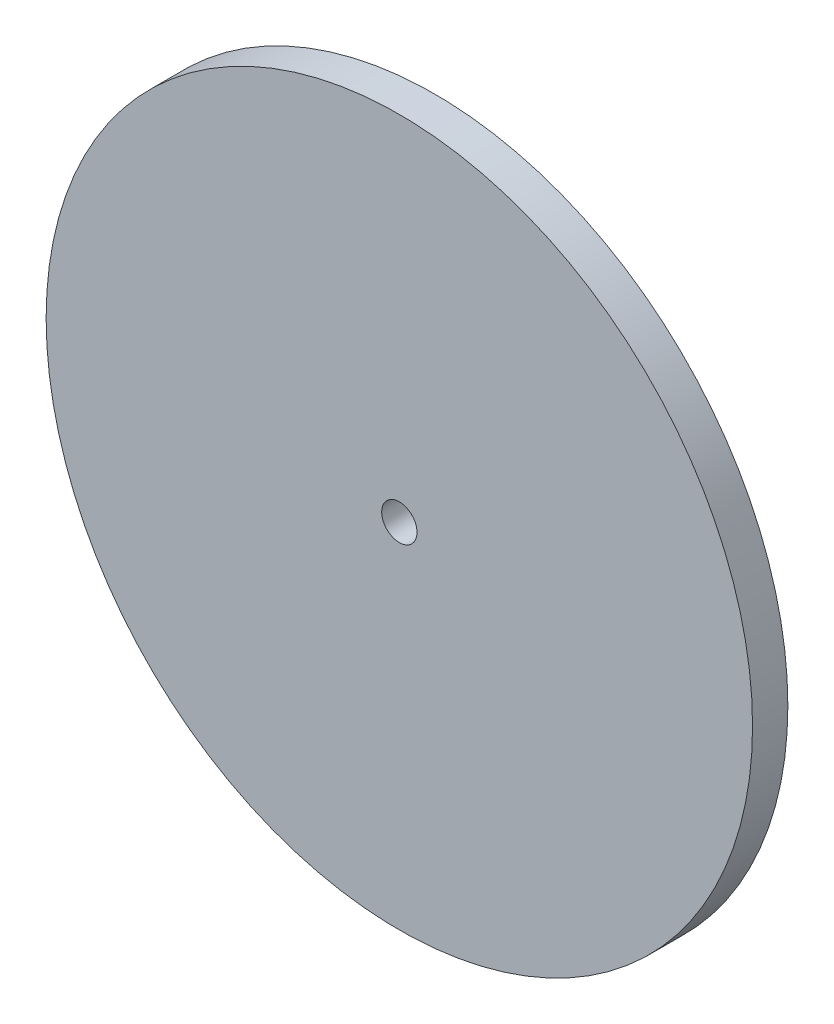
ISO-10303-21;
HEADER;
FILE_DESCRIPTION(('STEP AP214'),'2;1');
FILE_NAME('part.step','',(''),(''),'','','');
FILE_SCHEMA(('AUTOMOTIVE_DESIGN { 1 0 10303 214 1 1 1 1 }'));
ENDSEC;
DATA;
#1=APPLICATION_CONTEXT('core data for automotive mechanical design processes');
#2=APPLICATION_PROTOCOL_DEFINITION('international standard','automotive_design',2000,#1);
#3=PRODUCT_CONTEXT('',#1,'mechanical');
#4=PRODUCT('Part','Part','',(#3));
#5=PRODUCT_RELATED_PRODUCT_CATEGORY('part','',(#4));
#6=PRODUCT_DEFINITION_FORMATION('','',#4);
#7=PRODUCT_DEFINITION_CONTEXT('part definition',#1,'design');
#8=PRODUCT_DEFINITION('design','',#6,#7);
#9=PRODUCT_DEFINITION_SHAPE('','',#8);
#10=(LENGTH_UNIT() NAMED_UNIT(*) SI_UNIT(.MILLI.,.METRE.));
#11=(NAMED_UNIT(*) PLANE_ANGLE_UNIT() SI_UNIT($,.RADIAN.));
#12=(NAMED_UNIT(*) SI_UNIT($,.STERADIAN.) SOLID_ANGLE_UNIT());
#13=UNCERTAINTY_MEASURE_WITH_UNIT(LENGTH_MEASURE(1.E-05),#10,'distance_accuracy_value','');
#14=(GEOMETRIC_REPRESENTATION_CONTEXT(3) GLOBAL_UNCERTAINTY_ASSIGNED_CONTEXT((#13)) GLOBAL_UNIT_ASSIGNED_CONTEXT((#10,
#11,#12)) REPRESENTATION_CONTEXT('',''));
#15=CARTESIAN_POINT('',(0.,0.,0.));
#16=DIRECTION('',(0.,0.,1.));
#17=DIRECTION('',(1.,0.,0.));
#18=AXIS2_PLACEMENT_3D('',#15,#16,#17);
#19=CARTESIAN_POINT('',(0.,0.,25.));
#20=DIRECTION('',(0.,0.,-1.));
#21=DIRECTION('',(-1.,0.,0.));
#22=AXIS2_PLACEMENT_3D('',#19,#20,#21);
#23=CYLINDRICAL_SURFACE('',#22,500.);
#24=CARTESIAN_POINT('',(0.,0.,25.));
#25=DIRECTION('',(0.,0.,1.));
#26=DIRECTION('',(1.,0.,0.));
#27=AXIS2_PLACEMENT_3D('',#24,#25,#26);
#28=CIRCLE('',#27,500.);
#29=CARTESIAN_POINT('',(500.,0.,25.));
#30=VERTEX_POINT('',#29);
#31=EDGE_CURVE('E10',#30,#30,#28,.T.);
#32=ORIENTED_EDGE('',*,*,#31,.F.);
#33=EDGE_LOOP('',(#32));
#34=FACE_BOUND('',#33,.T.);
#35=CARTESIAN_POINT('',(0.,0.,-25.));
#36=DIRECTION('',(0.,0.,1.));
#37=DIRECTION('',(1.,0.,0.));
#38=AXIS2_PLACEMENT_3D('',#35,#36,#37);
#39=CIRCLE('',#38,500.);
#40=CARTESIAN_POINT('',(500.,0.,-25.));
#41=VERTEX_POINT('',#40);
#42=EDGE_CURVE('E37',#41,#41,#39,.T.);
#43=ORIENTED_EDGE('',*,*,#42,.T.);
#44=EDGE_LOOP('',(#43));
#45=FACE_BOUND('',#44,.T.);
#46=ADVANCED_FACE('F34',(#34,#45),#23,.T.);
#47=CARTESIAN_POINT('',(0.,0.,25.));
#48=DIRECTION('',(0.,0.,1.));
#49=DIRECTION('',(1.,0.,0.));
#50=AXIS2_PLACEMENT_3D('',#47,#48,#49);
#51=PLANE('',#50);
#52=CARTESIAN_POINT('',(0.,0.,25.));
#53=DIRECTION('',(0.,0.,1.));
#54=DIRECTION('',(1.,0.,0.));
#55=AXIS2_PLACEMENT_3D('',#52,#53,#54);
#56=CIRCLE('',#55,25.);
#57=CARTESIAN_POINT('',(25.,0.,25.));
#58=VERTEX_POINT('',#57);
#59=EDGE_CURVE('E48',#58,#58,#56,.T.);
#60=ORIENTED_EDGE('',*,*,#59,.F.);
#61=EDGE_LOOP('',(#60));
#62=FACE_BOUND('',#61,.T.);
#63=ORIENTED_EDGE('',*,*,#31,.T.);
#64=EDGE_LOOP('',(#63));
#65=FACE_BOUND('',#64,.T.);
#66=ADVANCED_FACE('F55',(#62,#65),#51,.T.);
#67=CARTESIAN_POINT('',(0.,0.,-25.));
#68=DIRECTION('',(0.,0.,1.));
#69=DIRECTION('',(1.,0.,0.));
#70=AXIS2_PLACEMENT_3D('',#67,#68,#69);
#71=PLANE('',#70);
#72=CARTESIAN_POINT('',(0.,0.,-25.));
#73=DIRECTION('',(0.,0.,1.));
#74=DIRECTION('',(1.,0.,0.));
#75=AXIS2_PLACEMENT_3D('',#72,#73,#74);
#76=CIRCLE('',#75,25.);
#77=CARTESIAN_POINT('',(25.,0.,-25.));
#78=VERTEX_POINT('',#77);
#79=EDGE_CURVE('E44',#78,#78,#76,.F.);
#80=ORIENTED_EDGE('',*,*,#79,.F.);
#81=EDGE_LOOP('',(#80));
#82=FACE_BOUND('',#81,.T.);
#83=ORIENTED_EDGE('',*,*,#42,.F.);
#84=EDGE_LOOP('',(#83));
#85=FACE_BOUND('',#84,.T.);
#86=ADVANCED_FACE('F57',(#82,#85),#71,.F.);
#87=CARTESIAN_POINT('',(0.,0.,-25.001));
#88=DIRECTION('',(0.,0.,1.));
#89=DIRECTION('',(1.,0.,0.));
#90=AXIS2_PLACEMENT_3D('',#87,#88,#89);
#91=CYLINDRICAL_SURFACE('',#90,25.);
#92=ORIENTED_EDGE('',*,*,#59,.T.);
#93=EDGE_LOOP('',(#92));
#94=FACE_BOUND('',#93,.T.);
#95=ORIENTED_EDGE('',*,*,#79,.T.);
#96=EDGE_LOOP('',(#95));
#97=FACE_BOUND('',#96,.T.);
#98=ADVANCED_FACE('F52',(#94,#97),#91,.F.);
#99=CLOSED_SHELL('',(#46,#66,#86,#98));
#100=MANIFOLD_SOLID_BREP('B2',#99);
#101=ADVANCED_BREP_SHAPE_REPRESENTATION('',(#18,#100),#14);
#102=SHAPE_DEFINITION_REPRESENTATION(#9,#101);
ENDSEC;
END-ISO-10303-21;
